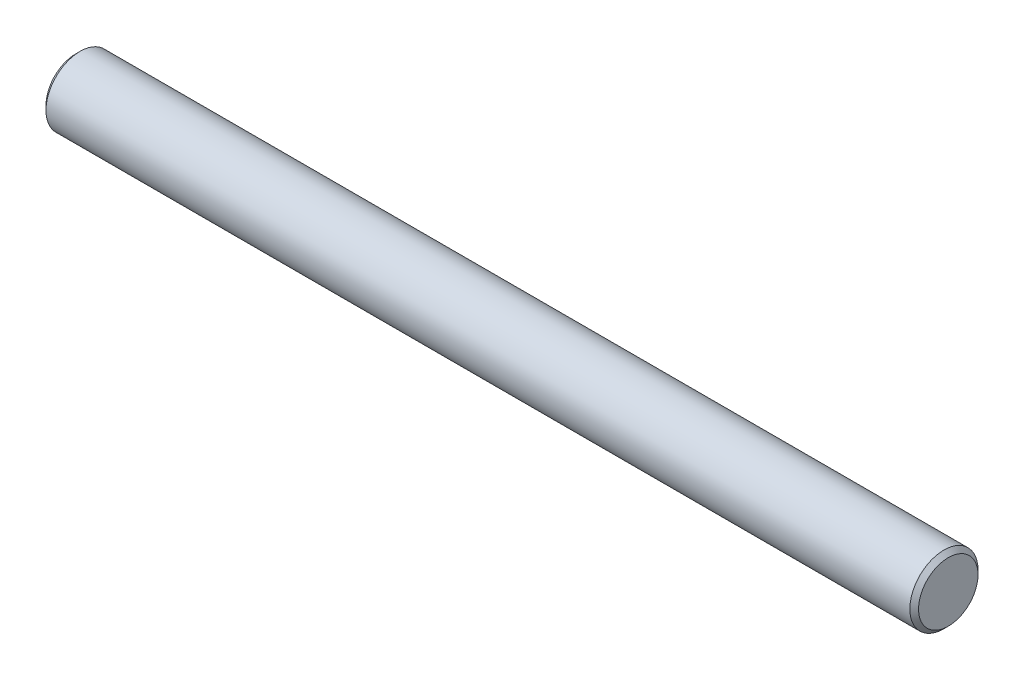
ISO-10303-21;
HEADER;
FILE_DESCRIPTION(('STEP AP214'),'2;1');
FILE_NAME('part.step','',(''),(''),'','','');
FILE_SCHEMA(('AUTOMOTIVE_DESIGN { 1 0 10303 214 1 1 1 1 }'));
ENDSEC;
DATA;
#1=APPLICATION_CONTEXT('core data for automotive mechanical design processes');
#2=APPLICATION_PROTOCOL_DEFINITION('international standard','automotive_design',2000,#1);
#3=PRODUCT_CONTEXT('',#1,'mechanical');
#4=PRODUCT('Part','Part','',(#3));
#5=PRODUCT_RELATED_PRODUCT_CATEGORY('part','',(#4));
#6=PRODUCT_DEFINITION_FORMATION('','',#4);
#7=PRODUCT_DEFINITION_CONTEXT('part definition',#1,'design');
#8=PRODUCT_DEFINITION('design','',#6,#7);
#9=PRODUCT_DEFINITION_SHAPE('','',#8);
#10=(LENGTH_UNIT() NAMED_UNIT(*) SI_UNIT(.MILLI.,.METRE.));
#11=(NAMED_UNIT(*) PLANE_ANGLE_UNIT() SI_UNIT($,.RADIAN.));
#12=(NAMED_UNIT(*) SI_UNIT($,.STERADIAN.) SOLID_ANGLE_UNIT());
#13=UNCERTAINTY_MEASURE_WITH_UNIT(LENGTH_MEASURE(1.E-05),#10,'distance_accuracy_value','');
#14=(GEOMETRIC_REPRESENTATION_CONTEXT(3) GLOBAL_UNCERTAINTY_ASSIGNED_CONTEXT((#13)) GLOBAL_UNIT_ASSIGNED_CONTEXT((#10,
#11,#12)) REPRESENTATION_CONTEXT('',''));
#15=CARTESIAN_POINT('',(0.,0.,0.));
#16=DIRECTION('',(0.,0.,1.));
#17=DIRECTION('',(1.,0.,0.));
#18=AXIS2_PLACEMENT_3D('',#15,#16,#17);
#19=CARTESIAN_POINT('',(0.,12.5,0.));
#20=DIRECTION('',(1.,0.,0.));
#21=DIRECTION('',(0.,0.,-1.));
#22=AXIS2_PLACEMENT_3D('',#19,#20,#21);
#23=PLANE('',#22);
#24=CARTESIAN_POINT('',(0.,0.,0.));
#25=DIRECTION('',(1.,0.,0.));
#26=DIRECTION('',(0.,0.,-1.));
#27=AXIS2_PLACEMENT_3D('',#24,#25,#26);
#28=CIRCLE('',#27,10.9);
#29=CARTESIAN_POINT('',(0.,0.,-10.9));
#30=VERTEX_POINT('',#29);
#31=EDGE_CURVE('E64',#30,#30,#28,.T.);
#32=ORIENTED_EDGE('',*,*,#31,.T.);
#33=EDGE_LOOP('',(#32));
#34=FACE_BOUND('',#33,.T.);
#35=ADVANCED_FACE('F34',(#34),#23,.T.);
#36=CARTESIAN_POINT('',(0.,0.,0.));
#37=DIRECTION('',(1.,0.,0.));
#38=DIRECTION('',(0.,0.,-1.));
#39=AXIS2_PLACEMENT_3D('',#36,#37,#38);
#40=CYLINDRICAL_SURFACE('',#39,12.5);
#41=CARTESIAN_POINT('',(-1.60000000000002,0.,0.));
#42=DIRECTION('',(1.,0.,0.));
#43=DIRECTION('',(0.,0.,-1.));
#44=AXIS2_PLACEMENT_3D('',#41,#42,#43);
#45=CIRCLE('',#44,12.5);
#46=CARTESIAN_POINT('',(-1.60000000000002,0.,-12.5));
#47=VERTEX_POINT('',#46);
#48=EDGE_CURVE('E41',#47,#47,#45,.F.);
#49=ORIENTED_EDGE('',*,*,#48,.T.);
#50=EDGE_LOOP('',(#49));
#51=FACE_BOUND('',#50,.T.);
#52=CARTESIAN_POINT('',(-318.4,0.,0.));
#53=DIRECTION('',(-1.,0.,0.));
#54=DIRECTION('',(0.,0.,1.));
#55=AXIS2_PLACEMENT_3D('',#52,#53,#54);
#56=CIRCLE('',#55,12.5);
#57=CARTESIAN_POINT('',(-318.4,0.,12.5));
#58=VERTEX_POINT('',#57);
#59=EDGE_CURVE('E67',#58,#58,#56,.F.);
#60=ORIENTED_EDGE('',*,*,#59,.T.);
#61=EDGE_LOOP('',(#60));
#62=FACE_BOUND('',#61,.T.);
#63=ADVANCED_FACE('F72',(#51,#62),#40,.T.);
#64=CARTESIAN_POINT('',(-320.,0.,0.));
#65=DIRECTION('',(-1.,0.,0.));
#66=DIRECTION('',(0.,0.,1.));
#67=AXIS2_PLACEMENT_3D('',#64,#65,#66);
#68=PLANE('',#67);
#69=CARTESIAN_POINT('',(-320.,0.,0.));
#70=DIRECTION('',(-1.,0.,0.));
#71=DIRECTION('',(0.,0.,1.));
#72=AXIS2_PLACEMENT_3D('',#69,#70,#71);
#73=CIRCLE('',#72,5.);
#74=CARTESIAN_POINT('',(-320.,0.,5.));
#75=VERTEX_POINT('',#74);
#76=EDGE_CURVE('E61',#75,#75,#73,.T.);
#77=ORIENTED_EDGE('',*,*,#76,.F.);
#78=EDGE_LOOP('',(#77));
#79=FACE_BOUND('',#78,.T.);
#80=CARTESIAN_POINT('',(-320.,0.,0.));
#81=DIRECTION('',(-1.,0.,0.));
#82=DIRECTION('',(0.,0.,1.));
#83=AXIS2_PLACEMENT_3D('',#80,#81,#82);
#84=CIRCLE('',#83,10.9);
#85=CARTESIAN_POINT('',(-320.,0.,10.9));
#86=VERTEX_POINT('',#85);
#87=EDGE_CURVE('E11',#86,#86,#84,.T.);
#88=ORIENTED_EDGE('',*,*,#87,.T.);
#89=EDGE_LOOP('',(#88));
#90=FACE_BOUND('',#89,.T.);
#91=ADVANCED_FACE('F78',(#79,#90),#68,.T.);
#92=CARTESIAN_POINT('',(0.,0.,0.));
#93=DIRECTION('',(-1.,0.,0.));
#94=DIRECTION('',(0.,0.,1.));
#95=AXIS2_PLACEMENT_3D('',#92,#93,#94);
#96=CONICAL_SURFACE('',#95,10.9,0.785398163397446);
#97=ORIENTED_EDGE('',*,*,#48,.F.);
#98=EDGE_LOOP('',(#97));
#99=FACE_BOUND('',#98,.T.);
#100=ORIENTED_EDGE('',*,*,#31,.F.);
#101=EDGE_LOOP('',(#100));
#102=FACE_BOUND('',#101,.T.);
#103=ADVANCED_FACE('F75',(#99,#102),#96,.T.);
#104=CARTESIAN_POINT('',(-318.4,0.,0.));
#105=DIRECTION('',(1.,0.,0.));
#106=DIRECTION('',(0.,0.,-1.));
#107=AXIS2_PLACEMENT_3D('',#104,#105,#106);
#108=CONICAL_SURFACE('',#107,12.5,0.785398163397463);
#109=ORIENTED_EDGE('',*,*,#87,.F.);
#110=EDGE_LOOP('',(#109));
#111=FACE_BOUND('',#110,.T.);
#112=ORIENTED_EDGE('',*,*,#59,.F.);
#113=EDGE_LOOP('',(#112));
#114=FACE_BOUND('',#113,.T.);
#115=ADVANCED_FACE('F36',(#111,#114),#108,.T.);
#116=CARTESIAN_POINT('',(-320.,0.,0.));
#117=DIRECTION('',(-1.,0.,0.));
#118=DIRECTION('',(0.,0.,1.));
#119=AXIS2_PLACEMENT_3D('',#116,#117,#118);
#120=CYLINDRICAL_SURFACE('',#119,5.);
#121=CARTESIAN_POINT('',(-300.,0.,0.));
#122=DIRECTION('',(-1.,0.,0.));
#123=DIRECTION('',(0.,0.,1.));
#124=AXIS2_PLACEMENT_3D('',#121,#122,#123);
#125=CIRCLE('',#124,5.);
#126=CARTESIAN_POINT('',(-300.,0.,5.));
#127=VERTEX_POINT('',#126);
#128=EDGE_CURVE('E56',#127,#127,#125,.T.);
#129=ORIENTED_EDGE('',*,*,#128,.F.);
#130=EDGE_LOOP('',(#129));
#131=FACE_BOUND('',#130,.T.);
#132=ORIENTED_EDGE('',*,*,#76,.T.);
#133=EDGE_LOOP('',(#132));
#134=FACE_BOUND('',#133,.T.);
#135=ADVANCED_FACE('F91',(#131,#134),#120,.F.);
#136=CARTESIAN_POINT('',(-300.,4.24999999999999,0.));
#137=DIRECTION('',(1.,0.,0.));
#138=DIRECTION('',(0.,0.,-1.));
#139=AXIS2_PLACEMENT_3D('',#136,#137,#138);
#140=PLANE('',#139);
#141=CARTESIAN_POINT('',(-300.,0.,0.));
#142=DIRECTION('',(-1.,0.,0.));
#143=DIRECTION('',(0.,0.,1.));
#144=AXIS2_PLACEMENT_3D('',#141,#142,#143);
#145=CIRCLE('',#144,4.24999999999999);
#146=CARTESIAN_POINT('',(-300.,0.,4.24999999999999));
#147=VERTEX_POINT('',#146);
#148=EDGE_CURVE('E53',#147,#147,#145,.T.);
#149=ORIENTED_EDGE('',*,*,#148,.F.);
#150=EDGE_LOOP('',(#149));
#151=FACE_BOUND('',#150,.T.);
#152=ORIENTED_EDGE('',*,*,#128,.T.);
#153=EDGE_LOOP('',(#152));
#154=FACE_BOUND('',#153,.T.);
#155=ADVANCED_FACE('F94',(#151,#154),#140,.F.);
#156=CARTESIAN_POINT('',(-320.,0.,0.));
#157=DIRECTION('',(-1.,0.,0.));
#158=DIRECTION('',(0.,0.,1.));
#159=AXIS2_PLACEMENT_3D('',#156,#157,#158);
#160=CYLINDRICAL_SURFACE('',#159,4.24999999999999);
#161=CARTESIAN_POINT('',(-295.5,0.,0.));
#162=DIRECTION('',(-1.,0.,0.));
#163=DIRECTION('',(0.,0.,1.));
#164=AXIS2_PLACEMENT_3D('',#161,#162,#163);
#165=CIRCLE('',#164,4.24999999999999);
#166=CARTESIAN_POINT('',(-295.5,0.,4.24999999999999));
#167=VERTEX_POINT('',#166);
#168=EDGE_CURVE('E51',#167,#167,#165,.T.);
#169=ORIENTED_EDGE('',*,*,#168,.F.);
#170=EDGE_LOOP('',(#169));
#171=FACE_BOUND('',#170,.T.);
#172=ORIENTED_EDGE('',*,*,#148,.T.);
#173=EDGE_LOOP('',(#172));
#174=FACE_BOUND('',#173,.T.);
#175=ADVANCED_FACE('F47',(#171,#174),#160,.F.);
#176=CARTESIAN_POINT('',(-295.5,0.,0.));
#177=DIRECTION('',(-1.,0.,0.));
#178=DIRECTION('',(0.,0.,1.));
#179=AXIS2_PLACEMENT_3D('',#176,#177,#178);
#180=CONICAL_SURFACE('',#179,4.24999999999999,1.02974425867665);
#181=CARTESIAN_POINT('',(-292.946342369133,0.,0.));
#182=VERTEX_POINT('',#181);
#183=VERTEX_LOOP('',#182);
#184=FACE_BOUND('',#183,.T.);
#185=ORIENTED_EDGE('',*,*,#168,.T.);
#186=EDGE_LOOP('',(#185));
#187=FACE_BOUND('',#186,.T.);
#188=ADVANCED_FACE('F44',(#184,#187),#180,.F.);
#189=CLOSED_SHELL('',(#35,#63,#91,#103,#115,#135,#155,#175,#188));
#190=MANIFOLD_SOLID_BREP('B2',#189);
#191=ADVANCED_BREP_SHAPE_REPRESENTATION('',(#18,#190),#14);
#192=SHAPE_DEFINITION_REPRESENTATION(#9,#191);
ENDSEC;
END-ISO-10303-21;
